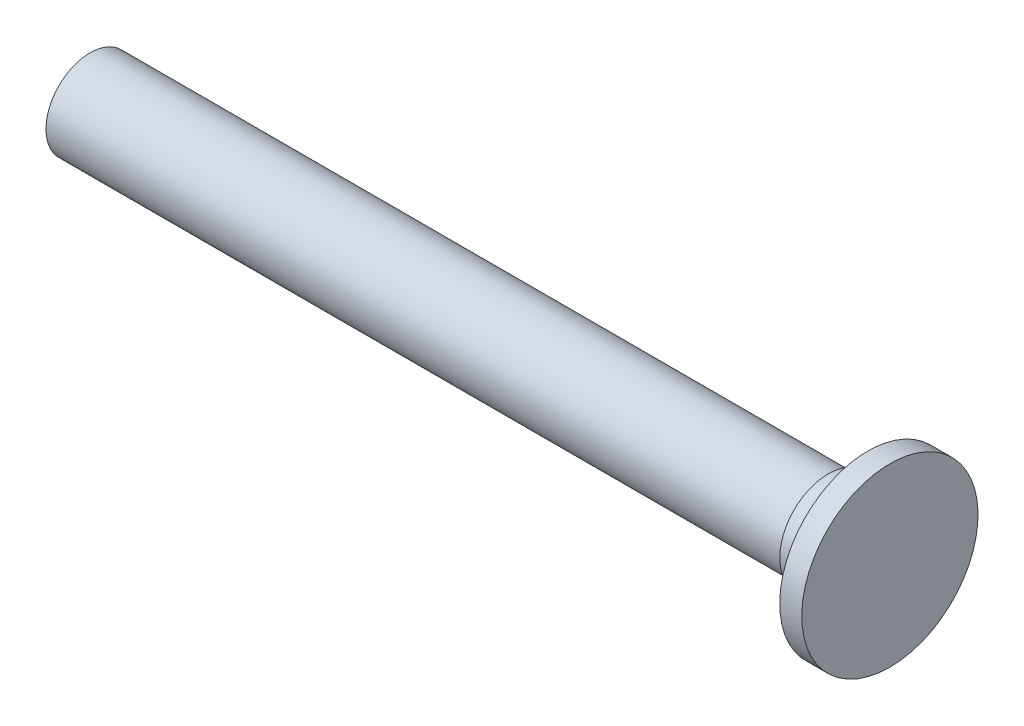
ISO-10303-21;
HEADER;
FILE_DESCRIPTION(('STEP AP214'),'2;1');
FILE_NAME('part.step','',(''),(''),'','','');
FILE_SCHEMA(('AUTOMOTIVE_DESIGN { 1 0 10303 214 1 1 1 1 }'));
ENDSEC;
DATA;
#1=APPLICATION_CONTEXT('core data for automotive mechanical design processes');
#2=APPLICATION_PROTOCOL_DEFINITION('international standard','automotive_design',2000,#1);
#3=PRODUCT_CONTEXT('',#1,'mechanical');
#4=PRODUCT('Part','Part','',(#3));
#5=PRODUCT_RELATED_PRODUCT_CATEGORY('part','',(#4));
#6=PRODUCT_DEFINITION_FORMATION('','',#4);
#7=PRODUCT_DEFINITION_CONTEXT('part definition',#1,'design');
#8=PRODUCT_DEFINITION('design','',#6,#7);
#9=PRODUCT_DEFINITION_SHAPE('','',#8);
#10=(LENGTH_UNIT() NAMED_UNIT(*) SI_UNIT(.MILLI.,.METRE.));
#11=(NAMED_UNIT(*) PLANE_ANGLE_UNIT() SI_UNIT($,.RADIAN.));
#12=(NAMED_UNIT(*) SI_UNIT($,.STERADIAN.) SOLID_ANGLE_UNIT());
#13=UNCERTAINTY_MEASURE_WITH_UNIT(LENGTH_MEASURE(1.E-05),#10,'distance_accuracy_value','');
#14=(GEOMETRIC_REPRESENTATION_CONTEXT(3) GLOBAL_UNCERTAINTY_ASSIGNED_CONTEXT((#13)) GLOBAL_UNIT_ASSIGNED_CONTEXT((#10,
#11,#12)) REPRESENTATION_CONTEXT('',''));
#15=CARTESIAN_POINT('',(0.,0.,0.));
#16=DIRECTION('',(0.,0.,1.));
#17=DIRECTION('',(1.,0.,0.));
#18=AXIS2_PLACEMENT_3D('',#15,#16,#17);
#19=CARTESIAN_POINT('',(0.,0.,0.));
#20=DIRECTION('',(-1.,0.,0.));
#21=DIRECTION('',(0.,-1.,0.));
#22=AXIS2_PLACEMENT_3D('',#19,#20,#21);
#23=PLANE('',#22);
#24=CARTESIAN_POINT('',(0.,0.,0.));
#25=DIRECTION('',(-1.,0.,0.));
#26=DIRECTION('',(0.,-1.,0.));
#27=AXIS2_PLACEMENT_3D('',#24,#25,#26);
#28=CIRCLE('',#27,20.);
#29=CARTESIAN_POINT('',(0.,-20.,0.));
#30=VERTEX_POINT('',#29);
#31=EDGE_CURVE('E10',#30,#30,#28,.T.);
#32=ORIENTED_EDGE('',*,*,#31,.F.);
#33=EDGE_LOOP('',(#32));
#34=FACE_BOUND('',#33,.T.);
#35=ADVANCED_FACE('F33',(#34),#23,.F.);
#36=CARTESIAN_POINT('',(68.0285781588337,0.,0.));
#37=DIRECTION('',(-1.,0.,0.));
#38=DIRECTION('',(0.,-1.,0.));
#39=AXIS2_PLACEMENT_3D('',#36,#37,#38);
#40=CYLINDRICAL_SURFACE('',#39,20.);
#41=CARTESIAN_POINT('',(-5.,0.,0.));
#42=DIRECTION('',(-1.,0.,0.));
#43=DIRECTION('',(0.,-1.,0.));
#44=AXIS2_PLACEMENT_3D('',#41,#42,#43);
#45=CIRCLE('',#44,20.);
#46=CARTESIAN_POINT('',(-5.,-20.,0.));
#47=VERTEX_POINT('',#46);
#48=EDGE_CURVE('E39',#47,#47,#45,.T.);
#49=ORIENTED_EDGE('',*,*,#48,.F.);
#50=EDGE_LOOP('',(#49));
#51=FACE_BOUND('',#50,.T.);
#52=ORIENTED_EDGE('',*,*,#31,.T.);
#53=EDGE_LOOP('',(#52));
#54=FACE_BOUND('',#53,.T.);
#55=ADVANCED_FACE('F81',(#51,#54),#40,.T.);
#56=CARTESIAN_POINT('',(-5.,20.,0.));
#57=DIRECTION('',(1.,0.,0.));
#58=DIRECTION('',(0.,1.,0.));
#59=AXIS2_PLACEMENT_3D('',#56,#57,#58);
#60=PLANE('',#59);
#61=CARTESIAN_POINT('',(-5.,0.,0.));
#62=DIRECTION('',(-1.,0.,0.));
#63=DIRECTION('',(0.,-1.,0.));
#64=AXIS2_PLACEMENT_3D('',#61,#62,#63);
#65=CIRCLE('',#64,11.);
#66=CARTESIAN_POINT('',(-5.,-11.,0.));
#67=VERTEX_POINT('',#66);
#68=EDGE_CURVE('E43',#67,#67,#65,.T.);
#69=ORIENTED_EDGE('',*,*,#68,.F.);
#70=EDGE_LOOP('',(#69));
#71=FACE_BOUND('',#70,.T.);
#72=ORIENTED_EDGE('',*,*,#48,.T.);
#73=EDGE_LOOP('',(#72));
#74=FACE_BOUND('',#73,.T.);
#75=ADVANCED_FACE('F76',(#71,#74),#60,.F.);
#76=CARTESIAN_POINT('',(68.0285781588337,0.,0.));
#77=DIRECTION('',(-1.,0.,0.));
#78=DIRECTION('',(0.,-1.,0.));
#79=AXIS2_PLACEMENT_3D('',#76,#77,#78);
#80=CYLINDRICAL_SURFACE('',#79,11.);
#81=CARTESIAN_POINT('',(-14.,0.,0.));
#82=DIRECTION('',(-1.,0.,0.));
#83=DIRECTION('',(0.,-1.,0.));
#84=AXIS2_PLACEMENT_3D('',#81,#82,#83);
#85=CIRCLE('',#84,11.);
#86=CARTESIAN_POINT('',(-14.,-11.,0.));
#87=VERTEX_POINT('',#86);
#88=EDGE_CURVE('E47',#87,#87,#85,.T.);
#89=ORIENTED_EDGE('',*,*,#88,.F.);
#90=EDGE_LOOP('',(#89));
#91=FACE_BOUND('',#90,.T.);
#92=ORIENTED_EDGE('',*,*,#68,.T.);
#93=EDGE_LOOP('',(#92));
#94=FACE_BOUND('',#93,.T.);
#95=ADVANCED_FACE('F70',(#91,#94),#80,.T.);
#96=CARTESIAN_POINT('',(-14.,11.,0.));
#97=DIRECTION('',(1.,0.,0.));
#98=DIRECTION('',(0.,1.,0.));
#99=AXIS2_PLACEMENT_3D('',#96,#97,#98);
#100=PLANE('',#99);
#101=CARTESIAN_POINT('',(-14.,0.,0.));
#102=DIRECTION('',(-1.,0.,0.));
#103=DIRECTION('',(0.,-1.,0.));
#104=AXIS2_PLACEMENT_3D('',#101,#102,#103);
#105=CIRCLE('',#104,10.);
#106=CARTESIAN_POINT('',(-14.,-10.,0.));
#107=VERTEX_POINT('',#106);
#108=EDGE_CURVE('E52',#107,#107,#105,.T.);
#109=ORIENTED_EDGE('',*,*,#108,.F.);
#110=EDGE_LOOP('',(#109));
#111=FACE_BOUND('',#110,.T.);
#112=ORIENTED_EDGE('',*,*,#88,.T.);
#113=EDGE_LOOP('',(#112));
#114=FACE_BOUND('',#113,.T.);
#115=ADVANCED_FACE('F64',(#111,#114),#100,.F.);
#116=CARTESIAN_POINT('',(68.0285781588337,0.,0.));
#117=DIRECTION('',(-1.,0.,0.));
#118=DIRECTION('',(0.,-1.,0.));
#119=AXIS2_PLACEMENT_3D('',#116,#117,#118);
#120=CYLINDRICAL_SURFACE('',#119,10.);
#121=CARTESIAN_POINT('',(-181.5,0.,0.));
#122=DIRECTION('',(-1.,0.,0.));
#123=DIRECTION('',(0.,-1.,0.));
#124=AXIS2_PLACEMENT_3D('',#121,#122,#123);
#125=CIRCLE('',#124,10.);
#126=CARTESIAN_POINT('',(-181.5,-10.,0.));
#127=VERTEX_POINT('',#126);
#128=EDGE_CURVE('E55',#127,#127,#125,.T.);
#129=ORIENTED_EDGE('',*,*,#128,.F.);
#130=EDGE_LOOP('',(#129));
#131=FACE_BOUND('',#130,.T.);
#132=ORIENTED_EDGE('',*,*,#108,.T.);
#133=EDGE_LOOP('',(#132));
#134=FACE_BOUND('',#133,.T.);
#135=ADVANCED_FACE('F61',(#131,#134),#120,.T.);
#136=CARTESIAN_POINT('',(-181.5,9.99999999999998,0.));
#137=DIRECTION('',(1.,0.,0.));
#138=DIRECTION('',(0.,1.,0.));
#139=AXIS2_PLACEMENT_3D('',#136,#137,#138);
#140=PLANE('',#139);
#141=ORIENTED_EDGE('',*,*,#128,.T.);
#142=EDGE_LOOP('',(#141));
#143=FACE_BOUND('',#142,.T.);
#144=ADVANCED_FACE('F59',(#143),#140,.F.);
#145=CLOSED_SHELL('',(#35,#55,#75,#95,#115,#135,#144));
#146=MANIFOLD_SOLID_BREP('B2',#145);
#147=ADVANCED_BREP_SHAPE_REPRESENTATION('',(#18,#146),#14);
#148=SHAPE_DEFINITION_REPRESENTATION(#9,#147);
ENDSEC;
END-ISO-10303-21;
